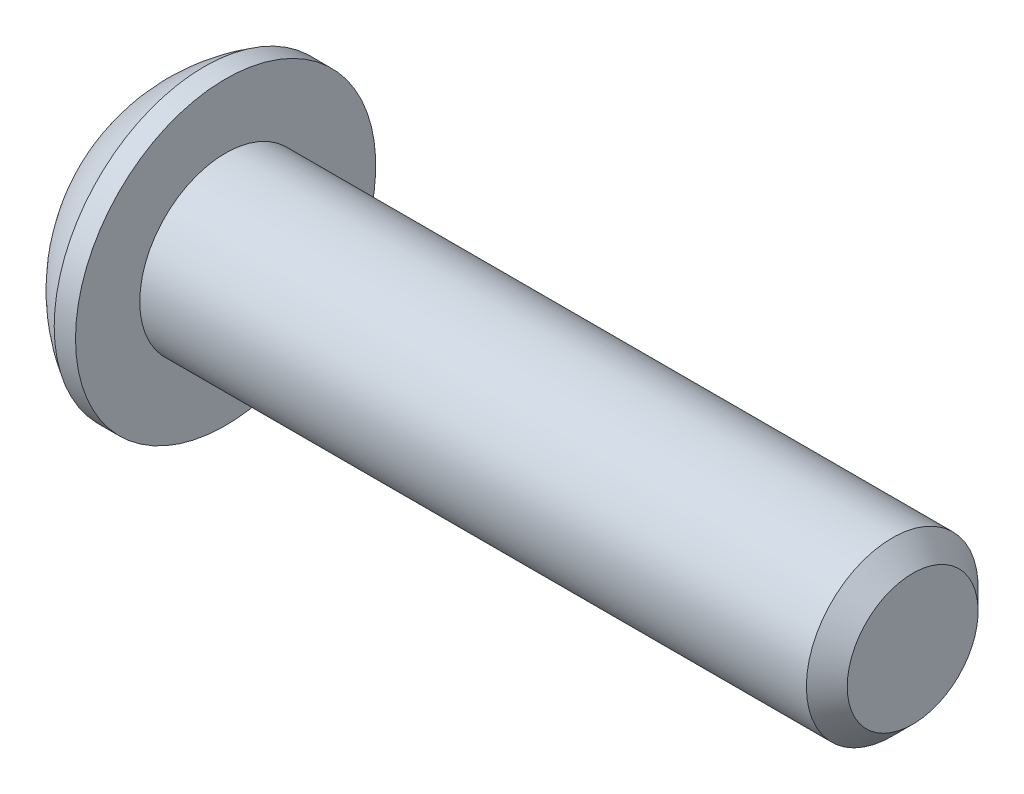
ISO-10303-21;
HEADER;
FILE_DESCRIPTION(('STEP AP214'),'2;1');
FILE_NAME('part.step','',(''),(''),'','','');
FILE_SCHEMA(('AUTOMOTIVE_DESIGN { 1 0 10303 214 1 1 1 1 }'));
ENDSEC;
DATA;
#1=APPLICATION_CONTEXT('core data for automotive mechanical design processes');
#2=APPLICATION_PROTOCOL_DEFINITION('international standard','automotive_design',2000,#1);
#3=PRODUCT_CONTEXT('',#1,'mechanical');
#4=PRODUCT('Part','Part','',(#3));
#5=PRODUCT_RELATED_PRODUCT_CATEGORY('part','',(#4));
#6=PRODUCT_DEFINITION_FORMATION('','',#4);
#7=PRODUCT_DEFINITION_CONTEXT('part definition',#1,'design');
#8=PRODUCT_DEFINITION('design','',#6,#7);
#9=PRODUCT_DEFINITION_SHAPE('','',#8);
#10=(LENGTH_UNIT() NAMED_UNIT(*) SI_UNIT(.MILLI.,.METRE.));
#11=(NAMED_UNIT(*) PLANE_ANGLE_UNIT() SI_UNIT($,.RADIAN.));
#12=(NAMED_UNIT(*) SI_UNIT($,.STERADIAN.) SOLID_ANGLE_UNIT());
#13=UNCERTAINTY_MEASURE_WITH_UNIT(LENGTH_MEASURE(1.E-05),#10,'distance_accuracy_value','');
#14=(GEOMETRIC_REPRESENTATION_CONTEXT(3) GLOBAL_UNCERTAINTY_ASSIGNED_CONTEXT((#13)) GLOBAL_UNIT_ASSIGNED_CONTEXT((#10,
#11,#12)) REPRESENTATION_CONTEXT('',''));
#15=CARTESIAN_POINT('',(0.,0.,0.));
#16=DIRECTION('',(0.,0.,1.));
#17=DIRECTION('',(1.,0.,0.));
#18=AXIS2_PLACEMENT_3D('',#15,#16,#17);
#19=CARTESIAN_POINT('',(0.,0.,0.));
#20=DIRECTION('',(-1.,0.,0.));
#21=DIRECTION('',(0.,0.,1.));
#22=AXIS2_PLACEMENT_3D('',#19,#20,#21);
#23=PLANE('',#22);
#24=CARTESIAN_POINT('',(0.,0.,0.));
#25=DIRECTION('',(-1.,0.,0.));
#26=DIRECTION('',(0.,0.,1.));
#27=AXIS2_PLACEMENT_3D('',#24,#25,#26);
#28=CIRCLE('',#27,2.77495);
#29=CARTESIAN_POINT('',(0.,2.77495,0.));
#30=VERTEX_POINT('',#29);
#31=EDGE_CURVE('E11',#30,#30,#28,.T.);
#32=ORIENTED_EDGE('',*,*,#31,.T.);
#33=EDGE_LOOP('',(#32));
#34=FACE_BOUND('',#33,.T.);
#35=DIRECTION('',(0.,-1.,0.));
#36=VECTOR('',#35,1.);
#37=CARTESIAN_POINT('',(0.,-1.14384635331849,1.9812));
#38=LINE('',#37,#36);
#39=CARTESIAN_POINT('',(0.,1.14384635331849,1.9812));
#40=VERTEX_POINT('',#39);
#41=CARTESIAN_POINT('',(0.,-1.14384635331849,1.9812));
#42=VERTEX_POINT('',#41);
#43=EDGE_CURVE('E46',#40,#42,#38,.T.);
#44=ORIENTED_EDGE('',*,*,#43,.T.);
#45=DIRECTION('',(0.,-0.5,-0.866025403784439));
#46=VECTOR('',#45,1.);
#47=CARTESIAN_POINT('',(0.,-2.28769270663697,0.));
#48=LINE('',#47,#46);
#49=CARTESIAN_POINT('',(0.,-2.28769270663697,0.));
#50=VERTEX_POINT('',#49);
#51=EDGE_CURVE('E367',#42,#50,#48,.T.);
#52=ORIENTED_EDGE('',*,*,#51,.T.);
#53=DIRECTION('',(0.,0.5,-0.866025403784439));
#54=VECTOR('',#53,1.);
#55=CARTESIAN_POINT('',(0.,-1.14384635331849,-1.9812));
#56=LINE('',#55,#54);
#57=CARTESIAN_POINT('',(0.,-1.14384635331849,-1.9812));
#58=VERTEX_POINT('',#57);
#59=EDGE_CURVE('E131',#50,#58,#56,.T.);
#60=ORIENTED_EDGE('',*,*,#59,.T.);
#61=DIRECTION('',(0.,1.,0.));
#62=VECTOR('',#61,1.);
#63=CARTESIAN_POINT('',(0.,1.14384635331849,-1.9812));
#64=LINE('',#63,#62);
#65=CARTESIAN_POINT('',(0.,1.14384635331849,-1.9812));
#66=VERTEX_POINT('',#65);
#67=EDGE_CURVE('E370',#58,#66,#64,.T.);
#68=ORIENTED_EDGE('',*,*,#67,.T.);
#69=DIRECTION('',(0.,0.5,0.866025403784438));
#70=VECTOR('',#69,1.);
#71=CARTESIAN_POINT('',(0.,2.28769270663697,0.));
#72=LINE('',#71,#70);
#73=CARTESIAN_POINT('',(0.,2.28769270663697,0.));
#74=VERTEX_POINT('',#73);
#75=EDGE_CURVE('E372',#66,#74,#72,.T.);
#76=ORIENTED_EDGE('',*,*,#75,.T.);
#77=DIRECTION('',(0.,-0.5,0.866025403784438));
#78=VECTOR('',#77,1.);
#79=CARTESIAN_POINT('',(0.,1.14384635331849,1.9812));
#80=LINE('',#79,#78);
#81=EDGE_CURVE('E374',#74,#40,#80,.T.);
#82=ORIENTED_EDGE('',*,*,#81,.T.);
#83=EDGE_LOOP('',(#44,#52,#60,#68,#76,#82));
#84=FACE_BOUND('',#83,.T.);
#85=ADVANCED_FACE('F32',(#34,#84),#23,.T.);
#86=CARTESIAN_POINT('',(5.78512506188119,0.,0.));
#87=DIRECTION('',(-1.,0.,0.));
#88=DIRECTION('',(0.,1.,0.));
#89=AXIS2_PLACEMENT_3D('',#86,#87,#88);
#90=SPHERICAL_SURFACE('',#89,6.41623094067739);
#91=CARTESIAN_POINT('',(2.5654,0.,0.));
#92=DIRECTION('',(-1.,0.,0.));
#93=DIRECTION('',(0.,0.,1.));
#94=AXIS2_PLACEMENT_3D('',#91,#92,#93);
#95=CIRCLE('',#94,5.5499);
#96=CARTESIAN_POINT('',(2.5654,5.5499,0.));
#97=VERTEX_POINT('',#96);
#98=EDGE_CURVE('E39',#97,#97,#95,.T.);
#99=CARTESIAN_POINT('',(2.5654,5.5499,0.));
#100=CARTESIAN_POINT('',(2.53083708566419,5.52984868712258,0.));
#101=CARTESIAN_POINT('',(2.49646152825914,5.50947442663449,0.));
#102=CARTESIAN_POINT('',(2.42809701945272,5.46808729773921,0.));
#103=CARTESIAN_POINT('',(2.39410806805135,5.44707442933201,0.));
#104=CARTESIAN_POINT('',(2.32652866339446,5.40441737190071,0.));
#105=CARTESIAN_POINT('',(2.29293821013895,5.38277318287661,0.));
#106=CARTESIAN_POINT('',(2.22616751866502,5.33886105159856,0.));
#107=CARTESIAN_POINT('',(2.19298728044662,5.3165931093446,0.));
#108=CARTESIAN_POINT('',(2.12704860244366,5.27144124070729,0.));
#109=CARTESIAN_POINT('',(2.09429016265911,5.24855731432393,0.));
#110=CARTESIAN_POINT('',(2.02920651509859,5.20218146582175,0.));
#111=CARTESIAN_POINT('',(1.99688130732261,5.17868954370292,0.));
#112=CARTESIAN_POINT('',(1.93267540683267,5.13110590319174,0.));
#113=CARTESIAN_POINT('',(1.90079471411871,5.10701418479938,0.));
#114=CARTESIAN_POINT('',(1.83748897146475,5.05823936086599,0.));
#115=CARTESIAN_POINT('',(1.80606392152475,5.03355625532495,0.));
#116=CARTESIAN_POINT('',(1.74368043314138,4.98360727255644,0.));
#117=CARTESIAN_POINT('',(1.71272199469802,4.95834139532897,0.));
#118=CARTESIAN_POINT('',(1.65128253514951,4.90723568808467,0.));
#119=CARTESIAN_POINT('',(1.62080151404435,4.88139585806785,0.));
#120=CARTESIAN_POINT('',(1.56032752837792,4.82915126447053,0.));
#121=CARTESIAN_POINT('',(1.53033456381665,4.80274650089003,0.));
#122=CARTESIAN_POINT('',(1.4708471600897,4.74938125657909,0.));
#123=CARTESIAN_POINT('',(1.44135272092403,4.72242077584865,0.));
#124=CARTESIAN_POINT('',(1.38287266283316,4.6679535076206,0.));
#125=CARTESIAN_POINT('',(1.35388704390797,4.64044672012299,0.));
#126=CARTESIAN_POINT('',(1.29643474354243,4.58489643942842,0.));
#127=CARTESIAN_POINT('',(1.26796806210209,4.55685294623144,0.));
#128=CARTESIAN_POINT('',(1.21156357281885,4.50023904253956,0.));
#129=CARTESIAN_POINT('',(1.18362576497595,4.47166863204465,0.));
#130=CARTESIAN_POINT('',(1.12828877440023,4.41401086607543,0.));
#131=CARTESIAN_POINT('',(1.10088959166741,4.38492351060113,0.));
#132=CARTESIAN_POINT('',(1.04663941482087,4.32624200742802,0.));
#133=CARTESIAN_POINT('',(1.01978842070714,4.2966478597292,0.));
#134=CARTESIAN_POINT('',(0.966643993266067,4.2369631017545,0.));
#135=CARTESIAN_POINT('',(0.940350559938718,4.20687249147862,0.));
#136=CARTESIAN_POINT('',(0.888330431624668,4.14620531128433,0.));
#137=CARTESIAN_POINT('',(0.862603736637966,4.11562874136591,0.));
#138=CARTESIAN_POINT('',(0.811726064743087,4.05400031444217,0.));
#139=CARTESIAN_POINT('',(0.786575087834909,4.02294845743684,0.));
#140=CARTESIAN_POINT('',(0.736857630884289,3.96038029479081,0.));
#141=CARTESIAN_POINT('',(0.712291150841846,3.9288639891501,0.));
#142=CARTESIAN_POINT('',(0.663751262394899,3.8653779297977,0.));
#143=CARTESIAN_POINT('',(0.639777853990395,3.833408176086,0.));
#144=CARTESIAN_POINT('',(0.592432476584126,3.76902637942894,0.));
#145=CARTESIAN_POINT('',(0.569060507582361,3.73661433648358,0.));
#146=CARTESIAN_POINT('',(0.522926166816146,3.67135927457555,0.));
#147=CARTESIAN_POINT('',(0.500163795051696,3.63851625561289,0.));
#148=CARTESIAN_POINT('',(0.455256593824864,3.57241070531295,0.));
#149=CARTESIAN_POINT('',(0.433111764362482,3.53914817397566,0.));
#150=CARTESIAN_POINT('',(0.389447377232277,3.47221520900886,0.));
#151=CARTESIAN_POINT('',(0.367927819564455,3.43854477537934,0.));
#152=CARTESIAN_POINT('',(0.325521487354905,3.37080775824281,0.));
#153=CARTESIAN_POINT('',(0.304634712813178,3.3367411747358,0.));
#154=CARTESIAN_POINT('',(0.263501236996927,3.26822374869429,0.));
#155=CARTESIAN_POINT('',(0.243254535722402,3.23377290615979,0.));
#156=CARTESIAN_POINT('',(0.203408274368181,3.16449898643303,0.));
#157=CARTESIAN_POINT('',(0.183808714288484,3.12967590924077,0.));
#158=CARTESIAN_POINT('',(0.145263572892659,3.05966967674635,0.));
#159=CARTESIAN_POINT('',(0.126317991576533,3.02448652144419,0.));
#160=CARTESIAN_POINT('',(0.0890874337230981,2.95377240655615,0.));
#161=CARTESIAN_POINT('',(0.0708024571857902,2.91824144697028,0.));
#162=CARTESIAN_POINT('',(0.0348994419493873,2.84684415010637,0.));
#163=CARTESIAN_POINT('',(0.0172814032502923,2.81097781282834,0.));
#164=CARTESIAN_POINT('',(0.,2.77495,0.));
#165=B_SPLINE_CURVE_WITH_KNOTS('',3,(#99,#100,#101,#102,#103,#104,#105,#106,#107,#108,#109,#110,
#111,#112,#113,#114,#115,#116,#117,#118,#119,#120,#121,#122,#123,#124,#125,#126,#127,#128,#129,
#130,#131,#132,#133,#134,#135,#136,#137,#138,#139,#140,#141,#142,#143,#144,#145,#146,#147,#148,
#149,#150,#151,#152,#153,#154,#155,#156,#157,#158,#159,#160,#161,#162,#163,#164),.UNSPECIFIED.,
.F.,.F.,(4,2,2,2,2,2,2,2,2,2,2,2,2,2,2,2,2,2,2,2,2,2,2,2,2,2,2,2,2,2,2,2,4),(0.,
0.119872570538485,0.239745141076968,0.359617711615453,0.479490282153937,0.599362852692422,
0.719235423230905,0.83910799376939,0.958980564307874,1.07885313484636,1.19872570538484,
1.31859827592333,1.43847084646181,1.55834341700029,1.67821598753878,1.79808855807726,
1.91796112861575,2.03783369915423,2.15770626969272,2.2775788402312,2.39745141076968,
2.51732398130817,2.63719655184665,2.75706912238514,2.87694169292362,2.99681426346211,
3.11668683400059,3.23655940453907,3.35643197507756,3.47630454561604,3.59617711615453,
3.71604968669301,3.8359222572315),.UNSPECIFIED.);
#166=EDGE_CURVE('BSEAM158',#97,#30,#165,.T.);
#167=ORIENTED_EDGE('',*,*,#98,.T.);
#168=ORIENTED_EDGE('',*,*,#31,.F.);
#169=ORIENTED_EDGE('',*,*,#166,.T.);
#170=ORIENTED_EDGE('',*,*,#166,.F.);
#171=EDGE_LOOP('',(#167,#169,#168,#170));
#172=FACE_BOUND('',#171,.T.);
#173=ADVANCED_FACE('F158',(#172),#90,.T.);
#174=CARTESIAN_POINT('',(0.,0.,0.));
#175=DIRECTION('',(-1.,0.,0.));
#176=DIRECTION('',(0.,0.,1.));
#177=AXIS2_PLACEMENT_3D('',#174,#175,#176);
#178=CYLINDRICAL_SURFACE('',#177,5.5499);
#179=ORIENTED_EDGE('',*,*,#98,.F.);
#180=EDGE_LOOP('',(#179));
#181=FACE_BOUND('',#180,.T.);
#182=CARTESIAN_POINT('',(3.3528,0.,0.));
#183=DIRECTION('',(-1.,0.,0.));
#184=DIRECTION('',(0.,0.,1.));
#185=AXIS2_PLACEMENT_3D('',#182,#183,#184);
#186=CIRCLE('',#185,5.5499);
#187=CARTESIAN_POINT('',(3.3528,0.,5.5499));
#188=VERTEX_POINT('',#187);
#189=EDGE_CURVE('E153',#188,#188,#186,.T.);
#190=ORIENTED_EDGE('',*,*,#189,.T.);
#191=EDGE_LOOP('',(#190));
#192=FACE_BOUND('',#191,.T.);
#193=ADVANCED_FACE('F161',(#181,#192),#178,.T.);
#194=CARTESIAN_POINT('',(3.3528,3.175,0.));
#195=DIRECTION('',(-1.,0.,0.));
#196=DIRECTION('',(0.,0.,1.));
#197=AXIS2_PLACEMENT_3D('',#194,#195,#196);
#198=PLANE('',#197);
#199=ORIENTED_EDGE('',*,*,#189,.F.);
#200=EDGE_LOOP('',(#199));
#201=FACE_BOUND('',#200,.T.);
#202=CARTESIAN_POINT('',(3.3528,0.,0.));
#203=DIRECTION('',(-1.,0.,0.));
#204=DIRECTION('',(0.,0.,1.));
#205=AXIS2_PLACEMENT_3D('',#202,#203,#204);
#206=CIRCLE('',#205,3.175);
#207=CARTESIAN_POINT('',(3.3528,0.,3.175));
#208=VERTEX_POINT('',#207);
#209=EDGE_CURVE('E150',#208,#208,#206,.T.);
#210=ORIENTED_EDGE('',*,*,#209,.T.);
#211=EDGE_LOOP('',(#210));
#212=FACE_BOUND('',#211,.T.);
#213=ADVANCED_FACE('F164',(#201,#212),#198,.F.);
#214=CARTESIAN_POINT('',(0.,0.,0.));
#215=DIRECTION('',(-1.,0.,0.));
#216=DIRECTION('',(0.,0.,1.));
#217=AXIS2_PLACEMENT_3D('',#214,#215,#216);
#218=CYLINDRICAL_SURFACE('',#217,3.175);
#219=ORIENTED_EDGE('',*,*,#209,.F.);
#220=EDGE_LOOP('',(#219));
#221=FACE_BOUND('',#220,.T.);
#222=CARTESIAN_POINT('',(27.99715,0.,0.));
#223=DIRECTION('',(-1.,0.,0.));
#224=DIRECTION('',(0.,0.,1.));
#225=AXIS2_PLACEMENT_3D('',#222,#223,#224);
#226=CIRCLE('',#225,3.175);
#227=CARTESIAN_POINT('',(27.99715,0.,3.175));
#228=VERTEX_POINT('',#227);
#229=EDGE_CURVE('E147',#228,#228,#226,.T.);
#230=ORIENTED_EDGE('',*,*,#229,.T.);
#231=EDGE_LOOP('',(#230));
#232=FACE_BOUND('',#231,.T.);
#233=ADVANCED_FACE('F170',(#221,#232),#218,.T.);
#234=CARTESIAN_POINT('',(28.7528,0.,0.));
#235=DIRECTION('',(-1.,0.,0.));
#236=DIRECTION('',(0.,0.,1.));
#237=AXIS2_PLACEMENT_3D('',#234,#235,#236);
#238=CONICAL_SURFACE('',#237,2.41935,0.785398163397456);
#239=ORIENTED_EDGE('',*,*,#229,.F.);
#240=EDGE_LOOP('',(#239));
#241=FACE_BOUND('',#240,.T.);
#242=CARTESIAN_POINT('',(28.7528,0.,0.));
#243=DIRECTION('',(-1.,0.,0.));
#244=DIRECTION('',(0.,0.,1.));
#245=AXIS2_PLACEMENT_3D('',#242,#243,#244);
#246=CIRCLE('',#245,2.41935);
#247=CARTESIAN_POINT('',(28.7528,0.,2.41935));
#248=VERTEX_POINT('',#247);
#249=EDGE_CURVE('E143',#248,#248,#246,.T.);
#250=ORIENTED_EDGE('',*,*,#249,.T.);
#251=EDGE_LOOP('',(#250));
#252=FACE_BOUND('',#251,.T.);
#253=ADVANCED_FACE('F176',(#241,#252),#238,.T.);
#254=CARTESIAN_POINT('',(28.7528,0.,0.));
#255=DIRECTION('',(-1.,0.,0.));
#256=DIRECTION('',(0.,0.,1.));
#257=AXIS2_PLACEMENT_3D('',#254,#255,#256);
#258=PLANE('',#257);
#259=ORIENTED_EDGE('',*,*,#249,.F.);
#260=EDGE_LOOP('',(#259));
#261=FACE_BOUND('',#260,.T.);
#262=ADVANCED_FACE('F182',(#261),#258,.F.);
#263=CARTESIAN_POINT('',(2.2098,-2.28769270663697,0.));
#264=DIRECTION('',(0.,0.866025403784439,-0.5));
#265=DIRECTION('',(0.,0.5,0.866025403784439));
#266=AXIS2_PLACEMENT_3D('',#263,#264,#265);
#267=PLANE('',#266);
#268=DIRECTION('',(0.,-0.5,-0.866025403784439));
#269=VECTOR('',#268,1.);
#270=CARTESIAN_POINT('',(2.2098,-2.28769270663697,0.));
#271=LINE('',#270,#269);
#272=CARTESIAN_POINT('',(2.2098,-1.14384635331849,1.9812));
#273=VERTEX_POINT('',#272);
#274=CARTESIAN_POINT('',(2.2098,-1.71576952997773,0.9906));
#275=VERTEX_POINT('',#274);
#276=EDGE_CURVE('E114',#273,#275,#271,.T.);
#277=ORIENTED_EDGE('',*,*,#276,.T.);
#278=CARTESIAN_POINT('',(2.2098,-2.28769270663697,0.));
#279=VERTEX_POINT('',#278);
#280=EDGE_CURVE('E107',#275,#279,#271,.T.);
#281=ORIENTED_EDGE('',*,*,#280,.T.);
#282=DIRECTION('',(-1.,0.,0.));
#283=VECTOR('',#282,1.);
#284=CARTESIAN_POINT('',(2.2098,-2.28769270663697,0.));
#285=LINE('',#284,#283);
#286=EDGE_CURVE('E111',#279,#50,#285,.T.);
#287=ORIENTED_EDGE('',*,*,#286,.T.);
#288=ORIENTED_EDGE('',*,*,#51,.F.);
#289=DIRECTION('',(-1.,0.,0.));
#290=VECTOR('',#289,1.);
#291=CARTESIAN_POINT('',(2.2098,-1.14384635331849,1.9812));
#292=LINE('',#291,#290);
#293=EDGE_CURVE('E366',#273,#42,#292,.T.);
#294=ORIENTED_EDGE('',*,*,#293,.F.);
#295=EDGE_LOOP('',(#277,#281,#287,#288,#294));
#296=FACE_BOUND('',#295,.T.);
#297=ADVANCED_FACE('F109',(#296),#267,.T.);
#298=CARTESIAN_POINT('',(2.2098,-1.14384635331849,-1.9812));
#299=DIRECTION('',(0.,0.866025403784439,0.5));
#300=DIRECTION('',(0.,-0.5,0.866025403784439));
#301=AXIS2_PLACEMENT_3D('',#298,#299,#300);
#302=PLANE('',#301);
#303=DIRECTION('',(0.,0.5,-0.866025403784439));
#304=VECTOR('',#303,1.);
#305=CARTESIAN_POINT('',(2.2098,-1.14384635331849,-1.9812));
#306=LINE('',#305,#304);
#307=CARTESIAN_POINT('',(2.2098,-1.71576952997773,-0.9906));
#308=VERTEX_POINT('',#307);
#309=EDGE_CURVE('E119',#279,#308,#306,.T.);
#310=ORIENTED_EDGE('',*,*,#309,.T.);
#311=CARTESIAN_POINT('',(2.2098,-1.14384635331849,-1.9812));
#312=VERTEX_POINT('',#311);
#313=EDGE_CURVE('E126',#308,#312,#306,.T.);
#314=ORIENTED_EDGE('',*,*,#313,.T.);
#315=DIRECTION('',(-1.,0.,0.));
#316=VECTOR('',#315,1.);
#317=CARTESIAN_POINT('',(2.2098,-1.14384635331849,-1.9812));
#318=LINE('',#317,#316);
#319=EDGE_CURVE('E133',#312,#58,#318,.T.);
#320=ORIENTED_EDGE('',*,*,#319,.T.);
#321=ORIENTED_EDGE('',*,*,#59,.F.);
#322=ORIENTED_EDGE('',*,*,#286,.F.);
#323=EDGE_LOOP('',(#310,#314,#320,#321,#322));
#324=FACE_BOUND('',#323,.T.);
#325=ADVANCED_FACE('F129',(#324),#302,.T.);
#326=CARTESIAN_POINT('',(2.2098,1.14384635331849,-1.9812));
#327=DIRECTION('',(0.,0.,1.));
#328=DIRECTION('',(1.,0.,0.));
#329=AXIS2_PLACEMENT_3D('',#326,#327,#328);
#330=PLANE('',#329);
#331=DIRECTION('',(0.,1.,0.));
#332=VECTOR('',#331,1.);
#333=CARTESIAN_POINT('',(2.2098,1.14384635331849,-1.9812));
#334=LINE('',#333,#332);
#335=CARTESIAN_POINT('',(2.2098,0.,-1.9812));
#336=VERTEX_POINT('',#335);
#337=EDGE_CURVE('E391',#312,#336,#334,.T.);
#338=ORIENTED_EDGE('',*,*,#337,.T.);
#339=CARTESIAN_POINT('',(2.2098,1.14384635331849,-1.9812));
#340=VERTEX_POINT('',#339);
#341=EDGE_CURVE('E125',#336,#340,#334,.T.);
#342=ORIENTED_EDGE('',*,*,#341,.T.);
#343=DIRECTION('',(-1.,0.,0.));
#344=VECTOR('',#343,1.);
#345=CARTESIAN_POINT('',(2.2098,1.14384635331849,-1.9812));
#346=LINE('',#345,#344);
#347=EDGE_CURVE('E138',#340,#66,#346,.T.);
#348=ORIENTED_EDGE('',*,*,#347,.T.);
#349=ORIENTED_EDGE('',*,*,#67,.F.);
#350=ORIENTED_EDGE('',*,*,#319,.F.);
#351=EDGE_LOOP('',(#338,#342,#348,#349,#350));
#352=FACE_BOUND('',#351,.T.);
#353=ADVANCED_FACE('F241',(#352),#330,.T.);
#354=CARTESIAN_POINT('',(2.2098,2.28769270663697,0.));
#355=DIRECTION('',(0.,-0.866025403784438,0.5));
#356=DIRECTION('',(0.,-0.5,-0.866025403784439));
#357=AXIS2_PLACEMENT_3D('',#354,#355,#356);
#358=PLANE('',#357);
#359=DIRECTION('',(0.,0.5,0.866025403784438));
#360=VECTOR('',#359,1.);
#361=CARTESIAN_POINT('',(2.2098,2.28769270663697,0.));
#362=LINE('',#361,#360);
#363=CARTESIAN_POINT('',(2.2098,1.71576952997773,-0.990600000000001));
#364=VERTEX_POINT('',#363);
#365=EDGE_CURVE('E353',#340,#364,#362,.T.);
#366=ORIENTED_EDGE('',*,*,#365,.T.);
#367=CARTESIAN_POINT('',(2.2098,2.28769270663697,0.));
#368=VERTEX_POINT('',#367);
#369=EDGE_CURVE('E393',#364,#368,#362,.T.);
#370=ORIENTED_EDGE('',*,*,#369,.T.);
#371=DIRECTION('',(-1.,0.,0.));
#372=VECTOR('',#371,1.);
#373=CARTESIAN_POINT('',(2.2098,2.28769270663697,0.));
#374=LINE('',#373,#372);
#375=EDGE_CURVE('E359',#368,#74,#374,.T.);
#376=ORIENTED_EDGE('',*,*,#375,.T.);
#377=ORIENTED_EDGE('',*,*,#75,.F.);
#378=ORIENTED_EDGE('',*,*,#347,.F.);
#379=EDGE_LOOP('',(#366,#370,#376,#377,#378));
#380=FACE_BOUND('',#379,.T.);
#381=ADVANCED_FACE('F250',(#380),#358,.T.);
#382=CARTESIAN_POINT('',(2.2098,1.14384635331849,1.9812));
#383=DIRECTION('',(0.,-0.866025403784438,-0.5));
#384=DIRECTION('',(0.,0.5,-0.866025403784439));
#385=AXIS2_PLACEMENT_3D('',#382,#383,#384);
#386=PLANE('',#385);
#387=DIRECTION('',(0.,-0.5,0.866025403784438));
#388=VECTOR('',#387,1.);
#389=CARTESIAN_POINT('',(2.2098,1.14384635331849,1.9812));
#390=LINE('',#389,#388);
#391=CARTESIAN_POINT('',(2.2098,1.71576952997773,0.990600000000001));
#392=VERTEX_POINT('',#391);
#393=EDGE_CURVE('E352',#368,#392,#390,.T.);
#394=ORIENTED_EDGE('',*,*,#393,.T.);
#395=CARTESIAN_POINT('',(2.2098,1.14384635331849,1.9812));
#396=VERTEX_POINT('',#395);
#397=EDGE_CURVE('E349',#392,#396,#390,.T.);
#398=ORIENTED_EDGE('',*,*,#397,.T.);
#399=DIRECTION('',(-1.,0.,0.));
#400=VECTOR('',#399,1.);
#401=CARTESIAN_POINT('',(2.2098,1.14384635331849,1.9812));
#402=LINE('',#401,#400);
#403=EDGE_CURVE('E379',#396,#40,#402,.T.);
#404=ORIENTED_EDGE('',*,*,#403,.T.);
#405=ORIENTED_EDGE('',*,*,#81,.F.);
#406=ORIENTED_EDGE('',*,*,#375,.F.);
#407=EDGE_LOOP('',(#394,#398,#404,#405,#406));
#408=FACE_BOUND('',#407,.T.);
#409=ADVANCED_FACE('F260',(#408),#386,.T.);
#410=CARTESIAN_POINT('',(2.2098,-1.14384635331849,1.9812));
#411=DIRECTION('',(0.,0.,-1.));
#412=DIRECTION('',(-1.,0.,0.));
#413=AXIS2_PLACEMENT_3D('',#410,#411,#412);
#414=PLANE('',#413);
#415=DIRECTION('',(0.,-1.,0.));
#416=VECTOR('',#415,1.);
#417=CARTESIAN_POINT('',(2.2098,-1.14384635331849,1.9812));
#418=LINE('',#417,#416);
#419=CARTESIAN_POINT('',(2.2098,0.,1.9812));
#420=VERTEX_POINT('',#419);
#421=EDGE_CURVE('E54',#396,#420,#418,.T.);
#422=ORIENTED_EDGE('',*,*,#421,.T.);
#423=EDGE_CURVE('E361',#420,#273,#418,.T.);
#424=ORIENTED_EDGE('',*,*,#423,.T.);
#425=ORIENTED_EDGE('',*,*,#293,.T.);
#426=ORIENTED_EDGE('',*,*,#43,.F.);
#427=ORIENTED_EDGE('',*,*,#403,.F.);
#428=EDGE_LOOP('',(#422,#424,#425,#426,#427));
#429=FACE_BOUND('',#428,.T.);
#430=ADVANCED_FACE('F270',(#429),#414,.T.);
#431=CARTESIAN_POINT('',(2.2098,0.,3.9624));
#432=DIRECTION('',(-1.,0.,0.));
#433=DIRECTION('',(0.,0.,1.));
#434=AXIS2_PLACEMENT_3D('',#431,#432,#433);
#435=PLANE('',#434);
#436=ORIENTED_EDGE('',*,*,#421,.F.);
#437=ORIENTED_EDGE('',*,*,#397,.F.);
#438=CARTESIAN_POINT('',(2.2098,0.,0.));
#439=DIRECTION('',(-1.,0.,0.));
#440=DIRECTION('',(0.,0.,1.));
#441=AXIS2_PLACEMENT_3D('',#438,#439,#440);
#442=CIRCLE('',#441,1.9812);
#443=EDGE_CURVE('E137',#420,#392,#442,.T.);
#444=ORIENTED_EDGE('',*,*,#443,.F.);
#445=EDGE_LOOP('',(#436,#437,#444));
#446=FACE_BOUND('',#445,.T.);
#447=ADVANCED_FACE('F280',(#446),#435,.T.);
#448=ORIENTED_EDGE('',*,*,#393,.F.);
#449=ORIENTED_EDGE('',*,*,#369,.F.);
#450=EDGE_CURVE('E144',#392,#364,#442,.T.);
#451=ORIENTED_EDGE('',*,*,#450,.F.);
#452=EDGE_LOOP('',(#448,#449,#451));
#453=FACE_BOUND('',#452,.T.);
#454=ADVANCED_FACE('F289',(#453),#435,.T.);
#455=ORIENTED_EDGE('',*,*,#365,.F.);
#456=ORIENTED_EDGE('',*,*,#341,.F.);
#457=EDGE_CURVE('E394',#364,#336,#442,.T.);
#458=ORIENTED_EDGE('',*,*,#457,.F.);
#459=EDGE_LOOP('',(#455,#456,#458));
#460=FACE_BOUND('',#459,.T.);
#461=ADVANCED_FACE('F300',(#460),#435,.T.);
#462=ORIENTED_EDGE('',*,*,#337,.F.);
#463=ORIENTED_EDGE('',*,*,#313,.F.);
#464=EDGE_CURVE('E392',#336,#308,#442,.T.);
#465=ORIENTED_EDGE('',*,*,#464,.F.);
#466=EDGE_LOOP('',(#462,#463,#465));
#467=FACE_BOUND('',#466,.T.);
#468=ADVANCED_FACE('F309',(#467),#435,.T.);
#469=ORIENTED_EDGE('',*,*,#309,.F.);
#470=ORIENTED_EDGE('',*,*,#280,.F.);
#471=EDGE_CURVE('E121',#308,#275,#442,.T.);
#472=ORIENTED_EDGE('',*,*,#471,.F.);
#473=EDGE_LOOP('',(#469,#470,#472));
#474=FACE_BOUND('',#473,.T.);
#475=ADVANCED_FACE('F120',(#474),#435,.T.);
#476=ORIENTED_EDGE('',*,*,#276,.F.);
#477=ORIENTED_EDGE('',*,*,#423,.F.);
#478=EDGE_CURVE('E132',#275,#420,#442,.T.);
#479=ORIENTED_EDGE('',*,*,#478,.F.);
#480=EDGE_LOOP('',(#476,#477,#479));
#481=FACE_BOUND('',#480,.T.);
#482=ADVANCED_FACE('F292',(#481),#435,.T.);
#483=CARTESIAN_POINT('',(3.3536463533185,0.,0.));
#484=DIRECTION('',(-1.,0.,0.));
#485=DIRECTION('',(0.,0.,1.));
#486=AXIS2_PLACEMENT_3D('',#483,#484,#485);
#487=CONICAL_SURFACE('',#486,0.,1.04719755119659);
#488=ORIENTED_EDGE('',*,*,#443,.T.);
#489=ORIENTED_EDGE('',*,*,#450,.T.);
#490=ORIENTED_EDGE('',*,*,#457,.T.);
#491=ORIENTED_EDGE('',*,*,#464,.T.);
#492=ORIENTED_EDGE('',*,*,#471,.T.);
#493=ORIENTED_EDGE('',*,*,#478,.T.);
#494=EDGE_LOOP('',(#488,#489,#490,#491,#492,#493));
#495=FACE_BOUND('',#494,.T.);
#496=CARTESIAN_POINT('',(3.3536463533185,0.,0.));
#497=VERTEX_POINT('',#496);
#498=VERTEX_LOOP('',#497);
#499=FACE_BOUND('',#498,.T.);
#500=ADVANCED_FACE('F333',(#495,#499),#487,.F.);
#501=CLOSED_SHELL('',(#85,#173,#193,#213,#233,#253,#262,#297,#325,#353,#381,#409,#430,#447,#454,
#461,#468,#475,#482,#500));
#502=MANIFOLD_SOLID_BREP('B2',#501);
#503=ADVANCED_BREP_SHAPE_REPRESENTATION('',(#18,#502),#14);
#504=SHAPE_DEFINITION_REPRESENTATION(#9,#503);
ENDSEC;
END-ISO-10303-21;
